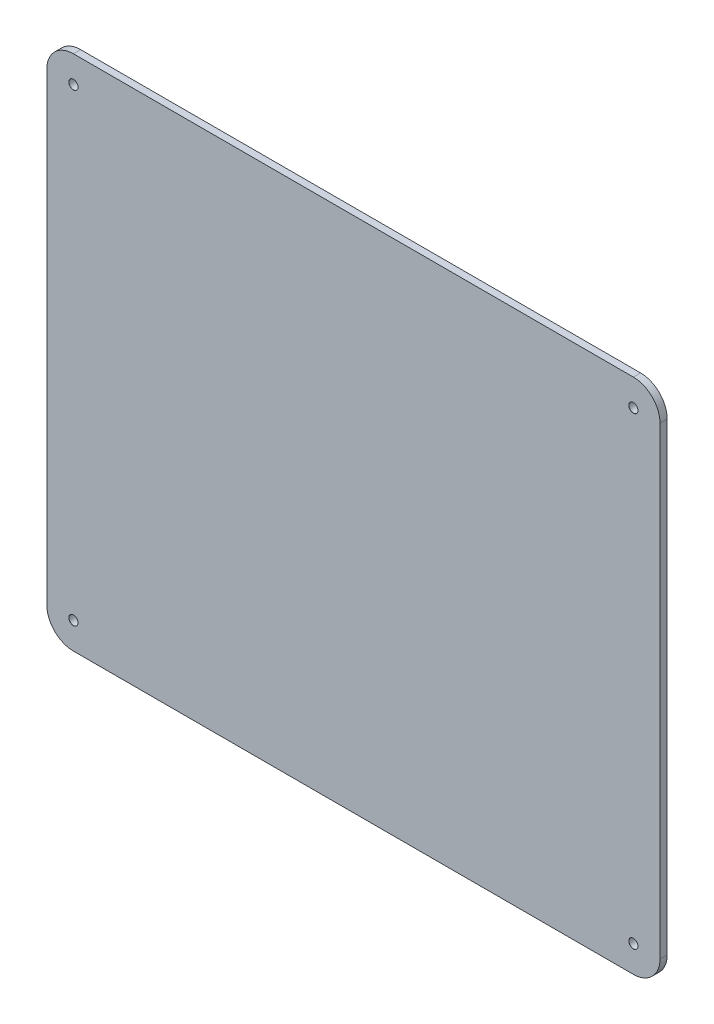
ISO-10303-21;
HEADER;
FILE_DESCRIPTION(('STEP AP214'),'2;1');
FILE_NAME('part.step','',(''),(''),'','','');
FILE_SCHEMA(('AUTOMOTIVE_DESIGN { 1 0 10303 214 1 1 1 1 }'));
ENDSEC;
DATA;
#1=APPLICATION_CONTEXT('core data for automotive mechanical design processes');
#2=APPLICATION_PROTOCOL_DEFINITION('international standard','automotive_design',2000,#1);
#3=PRODUCT_CONTEXT('',#1,'mechanical');
#4=PRODUCT('Part','Part','',(#3));
#5=PRODUCT_RELATED_PRODUCT_CATEGORY('part','',(#4));
#6=PRODUCT_DEFINITION_FORMATION('','',#4);
#7=PRODUCT_DEFINITION_CONTEXT('part definition',#1,'design');
#8=PRODUCT_DEFINITION('design','',#6,#7);
#9=PRODUCT_DEFINITION_SHAPE('','',#8);
#10=(LENGTH_UNIT() NAMED_UNIT(*) SI_UNIT(.MILLI.,.METRE.));
#11=(NAMED_UNIT(*) PLANE_ANGLE_UNIT() SI_UNIT($,.RADIAN.));
#12=(NAMED_UNIT(*) SI_UNIT($,.STERADIAN.) SOLID_ANGLE_UNIT());
#13=UNCERTAINTY_MEASURE_WITH_UNIT(LENGTH_MEASURE(1.E-05),#10,'distance_accuracy_value','');
#14=(GEOMETRIC_REPRESENTATION_CONTEXT(3) GLOBAL_UNCERTAINTY_ASSIGNED_CONTEXT((#13)) GLOBAL_UNIT_ASSIGNED_CONTEXT((#10,
#11,#12)) REPRESENTATION_CONTEXT('',''));
#15=CARTESIAN_POINT('',(0.,0.,0.));
#16=DIRECTION('',(0.,0.,1.));
#17=DIRECTION('',(1.,0.,0.));
#18=AXIS2_PLACEMENT_3D('',#15,#16,#17);
#19=CARTESIAN_POINT('',(-210.,-240.,0.));
#20=DIRECTION('',(0.,0.,-1.));
#21=DIRECTION('',(-1.,0.,0.));
#22=AXIS2_PLACEMENT_3D('',#19,#20,#21);
#23=PLANE('',#22);
#24=CARTESIAN_POINT('',(0.,-240.,0.));
#25=DIRECTION('',(0.,0.,1.));
#26=DIRECTION('',(1.,0.,0.));
#27=AXIS2_PLACEMENT_3D('',#24,#25,#26);
#28=CIRCLE('',#27,1.7);
#29=CARTESIAN_POINT('',(1.7,-240.,0.));
#30=VERTEX_POINT('',#29);
#31=EDGE_CURVE('E247',#30,#30,#28,.T.);
#32=ORIENTED_EDGE('',*,*,#31,.T.);
#33=EDGE_LOOP('',(#32));
#34=FACE_BOUND('',#33,.T.);
#35=CARTESIAN_POINT('',(-210.,-240.,0.));
#36=DIRECTION('',(0.,0.,1.));
#37=DIRECTION('',(1.,0.,0.));
#38=AXIS2_PLACEMENT_3D('',#35,#36,#37);
#39=CIRCLE('',#38,1.70000000000001);
#40=CARTESIAN_POINT('',(-208.3,-240.,0.));
#41=VERTEX_POINT('',#40);
#42=EDGE_CURVE('E235',#41,#41,#39,.T.);
#43=ORIENTED_EDGE('',*,*,#42,.T.);
#44=EDGE_LOOP('',(#43));
#45=FACE_BOUND('',#44,.T.);
#46=CARTESIAN_POINT('',(-210.,-65.988369189522,0.));
#47=DIRECTION('',(0.,0.,1.));
#48=DIRECTION('',(1.,0.,0.));
#49=AXIS2_PLACEMENT_3D('',#46,#47,#48);
#50=CIRCLE('',#49,1.70000000000001);
#51=CARTESIAN_POINT('',(-208.3,-65.988369189522,0.));
#52=VERTEX_POINT('',#51);
#53=EDGE_CURVE('E223',#52,#52,#50,.T.);
#54=ORIENTED_EDGE('',*,*,#53,.T.);
#55=EDGE_LOOP('',(#54));
#56=FACE_BOUND('',#55,.T.);
#57=CARTESIAN_POINT('',(-210.,-240.,0.));
#58=DIRECTION('',(0.,0.,1.));
#59=DIRECTION('',(-1.,0.,0.));
#60=AXIS2_PLACEMENT_3D('',#57,#58,#59);
#61=CIRCLE('',#60,10.);
#62=CARTESIAN_POINT('',(-220.,-240.,0.));
#63=VERTEX_POINT('',#62);
#64=CARTESIAN_POINT('',(-210.,-250.,0.));
#65=VERTEX_POINT('',#64);
#66=EDGE_CURVE('E145',#63,#65,#61,.T.);
#67=ORIENTED_EDGE('',*,*,#66,.F.);
#68=DIRECTION('',(0.,-1.,0.));
#69=VECTOR('',#68,1.);
#70=CARTESIAN_POINT('',(-220.,-240.,0.));
#71=LINE('',#70,#69);
#72=CARTESIAN_POINT('',(-220.,-65.9883691895221,0.));
#73=VERTEX_POINT('',#72);
#74=EDGE_CURVE('E96',#73,#63,#71,.T.);
#75=ORIENTED_EDGE('',*,*,#74,.F.);
#76=CARTESIAN_POINT('',(-210.,-65.988369189522,0.));
#77=DIRECTION('',(0.,0.,1.));
#78=DIRECTION('',(1.,0.,0.));
#79=AXIS2_PLACEMENT_3D('',#76,#77,#78);
#80=CIRCLE('',#79,10.);
#81=CARTESIAN_POINT('',(-210.,-55.988369189522,0.));
#82=VERTEX_POINT('',#81);
#83=EDGE_CURVE('E90',#82,#73,#80,.T.);
#84=ORIENTED_EDGE('',*,*,#83,.F.);
#85=DIRECTION('',(-1.,0.,0.));
#86=VECTOR('',#85,1.);
#87=CARTESIAN_POINT('',(0.,-55.988369189522,0.));
#88=LINE('',#87,#86);
#89=CARTESIAN_POINT('',(0.,-55.988369189522,0.));
#90=VERTEX_POINT('',#89);
#91=EDGE_CURVE('E132',#90,#82,#88,.T.);
#92=ORIENTED_EDGE('',*,*,#91,.F.);
#93=CARTESIAN_POINT('',(0.,-65.988369189522,0.));
#94=DIRECTION('',(0.,0.,1.));
#95=DIRECTION('',(1.,0.,0.));
#96=AXIS2_PLACEMENT_3D('',#93,#94,#95);
#97=CIRCLE('',#96,10.);
#98=CARTESIAN_POINT('',(10.,-65.9883691895221,0.));
#99=VERTEX_POINT('',#98);
#100=EDGE_CURVE('E159',#99,#90,#97,.T.);
#101=ORIENTED_EDGE('',*,*,#100,.F.);
#102=DIRECTION('',(0.,1.,0.));
#103=VECTOR('',#102,1.);
#104=CARTESIAN_POINT('',(10.,-240.,0.));
#105=LINE('',#104,#103);
#106=CARTESIAN_POINT('',(10.,-240.,0.));
#107=VERTEX_POINT('',#106);
#108=EDGE_CURVE('E156',#107,#99,#105,.T.);
#109=ORIENTED_EDGE('',*,*,#108,.F.);
#110=CARTESIAN_POINT('',(0.,-240.,0.));
#111=DIRECTION('',(0.,0.,1.));
#112=DIRECTION('',(1.,0.,0.));
#113=AXIS2_PLACEMENT_3D('',#110,#111,#112);
#114=CIRCLE('',#113,10.);
#115=CARTESIAN_POINT('',(0.,-250.,0.));
#116=VERTEX_POINT('',#115);
#117=EDGE_CURVE('E153',#116,#107,#114,.T.);
#118=ORIENTED_EDGE('',*,*,#117,.F.);
#119=DIRECTION('',(1.,0.,0.));
#120=VECTOR('',#119,1.);
#121=CARTESIAN_POINT('',(0.,-250.,0.));
#122=LINE('',#121,#120);
#123=EDGE_CURVE('E149',#65,#116,#122,.T.);
#124=ORIENTED_EDGE('',*,*,#123,.F.);
#125=EDGE_LOOP('',(#67,#75,#84,#92,#101,#109,#118,#124));
#126=FACE_BOUND('',#125,.T.);
#127=CARTESIAN_POINT('',(0.,-65.988369189522,0.));
#128=DIRECTION('',(0.,0.,1.));
#129=DIRECTION('',(1.,0.,0.));
#130=AXIS2_PLACEMENT_3D('',#127,#128,#129);
#131=CIRCLE('',#130,1.7);
#132=CARTESIAN_POINT('',(1.7,-65.988369189522,0.));
#133=VERTEX_POINT('',#132);
#134=EDGE_CURVE('E150',#133,#133,#131,.T.);
#135=ORIENTED_EDGE('',*,*,#134,.T.);
#136=EDGE_LOOP('',(#135));
#137=FACE_BOUND('',#136,.T.);
#138=ADVANCED_FACE('F43',(#34,#45,#56,#126,#137),#23,.T.);
#139=CARTESIAN_POINT('',(-210.,-240.,2.7));
#140=DIRECTION('',(0.,0.,-1.));
#141=DIRECTION('',(-1.,0.,0.));
#142=AXIS2_PLACEMENT_3D('',#139,#140,#141);
#143=CYLINDRICAL_SURFACE('',#142,10.);
#144=ORIENTED_EDGE('',*,*,#66,.T.);
#145=DIRECTION('',(0.,0.,-1.));
#146=VECTOR('',#145,1.);
#147=CARTESIAN_POINT('',(-210.,-250.,2.7));
#148=LINE('',#147,#146);
#149=CARTESIAN_POINT('',(-210.,-250.,2.7));
#150=VERTEX_POINT('',#149);
#151=EDGE_CURVE('E11',#150,#65,#148,.T.);
#152=ORIENTED_EDGE('',*,*,#151,.F.);
#153=CARTESIAN_POINT('',(-210.,-240.,2.7));
#154=DIRECTION('',(0.,0.,1.));
#155=DIRECTION('',(-1.,0.,0.));
#156=AXIS2_PLACEMENT_3D('',#153,#154,#155);
#157=CIRCLE('',#156,10.);
#158=CARTESIAN_POINT('',(-220.,-240.,2.7));
#159=VERTEX_POINT('',#158);
#160=EDGE_CURVE('E168',#159,#150,#157,.T.);
#161=ORIENTED_EDGE('',*,*,#160,.F.);
#162=DIRECTION('',(0.,0.,-1.));
#163=VECTOR('',#162,1.);
#164=CARTESIAN_POINT('',(-220.,-240.,2.7));
#165=LINE('',#164,#163);
#166=EDGE_CURVE('E141',#159,#63,#165,.T.);
#167=ORIENTED_EDGE('',*,*,#166,.T.);
#168=EDGE_LOOP('',(#144,#152,#161,#167));
#169=FACE_BOUND('',#168,.T.);
#170=ADVANCED_FACE('F45',(#169),#143,.T.);
#171=CARTESIAN_POINT('',(0.,-250.,2.7));
#172=DIRECTION('',(0.,1.,0.));
#173=DIRECTION('',(0.,0.,1.));
#174=AXIS2_PLACEMENT_3D('',#171,#172,#173);
#175=PLANE('',#174);
#176=ORIENTED_EDGE('',*,*,#123,.T.);
#177=DIRECTION('',(0.,0.,-1.));
#178=VECTOR('',#177,1.);
#179=CARTESIAN_POINT('',(0.,-250.,2.7));
#180=LINE('',#179,#178);
#181=CARTESIAN_POINT('',(0.,-250.,2.7));
#182=VERTEX_POINT('',#181);
#183=EDGE_CURVE('E53',#182,#116,#180,.T.);
#184=ORIENTED_EDGE('',*,*,#183,.F.);
#185=DIRECTION('',(1.,0.,0.));
#186=VECTOR('',#185,1.);
#187=CARTESIAN_POINT('',(0.,-250.,2.7));
#188=LINE('',#187,#186);
#189=EDGE_CURVE('E104',#150,#182,#188,.T.);
#190=ORIENTED_EDGE('',*,*,#189,.F.);
#191=ORIENTED_EDGE('',*,*,#151,.T.);
#192=EDGE_LOOP('',(#176,#184,#190,#191));
#193=FACE_BOUND('',#192,.T.);
#194=ADVANCED_FACE('F294',(#193),#175,.F.);
#195=CARTESIAN_POINT('',(0.,-240.,2.7));
#196=DIRECTION('',(0.,0.,-1.));
#197=DIRECTION('',(-1.,0.,0.));
#198=AXIS2_PLACEMENT_3D('',#195,#196,#197);
#199=CYLINDRICAL_SURFACE('',#198,10.);
#200=ORIENTED_EDGE('',*,*,#117,.T.);
#201=DIRECTION('',(0.,0.,-1.));
#202=VECTOR('',#201,1.);
#203=CARTESIAN_POINT('',(10.,-240.,2.7));
#204=LINE('',#203,#202);
#205=CARTESIAN_POINT('',(10.,-240.,2.7));
#206=VERTEX_POINT('',#205);
#207=EDGE_CURVE('E179',#206,#107,#204,.T.);
#208=ORIENTED_EDGE('',*,*,#207,.F.);
#209=CARTESIAN_POINT('',(0.,-240.,2.7));
#210=DIRECTION('',(0.,0.,1.));
#211=DIRECTION('',(1.,0.,0.));
#212=AXIS2_PLACEMENT_3D('',#209,#210,#211);
#213=CIRCLE('',#212,10.);
#214=EDGE_CURVE('E189',#182,#206,#213,.T.);
#215=ORIENTED_EDGE('',*,*,#214,.F.);
#216=ORIENTED_EDGE('',*,*,#183,.T.);
#217=EDGE_LOOP('',(#200,#208,#215,#216));
#218=FACE_BOUND('',#217,.T.);
#219=ADVANCED_FACE('F187',(#218),#199,.T.);
#220=CARTESIAN_POINT('',(10.,-240.,2.7));
#221=DIRECTION('',(-1.,0.,0.));
#222=DIRECTION('',(0.,0.,1.));
#223=AXIS2_PLACEMENT_3D('',#220,#221,#222);
#224=PLANE('',#223);
#225=ORIENTED_EDGE('',*,*,#108,.T.);
#226=DIRECTION('',(0.,0.,-1.));
#227=VECTOR('',#226,1.);
#228=CARTESIAN_POINT('',(10.,-65.9883691895221,2.7));
#229=LINE('',#228,#227);
#230=CARTESIAN_POINT('',(10.,-65.9883691895221,2.7));
#231=VERTEX_POINT('',#230);
#232=EDGE_CURVE('E175',#231,#99,#229,.T.);
#233=ORIENTED_EDGE('',*,*,#232,.F.);
#234=DIRECTION('',(0.,1.,0.));
#235=VECTOR('',#234,1.);
#236=CARTESIAN_POINT('',(10.,-240.,2.7));
#237=LINE('',#236,#235);
#238=EDGE_CURVE('E202',#206,#231,#237,.T.);
#239=ORIENTED_EDGE('',*,*,#238,.F.);
#240=ORIENTED_EDGE('',*,*,#207,.T.);
#241=EDGE_LOOP('',(#225,#233,#239,#240));
#242=FACE_BOUND('',#241,.T.);
#243=ADVANCED_FACE('F197',(#242),#224,.F.);
#244=CARTESIAN_POINT('',(0.,-65.988369189522,2.7));
#245=DIRECTION('',(0.,0.,-1.));
#246=DIRECTION('',(-1.,0.,0.));
#247=AXIS2_PLACEMENT_3D('',#244,#245,#246);
#248=CYLINDRICAL_SURFACE('',#247,10.);
#249=ORIENTED_EDGE('',*,*,#100,.T.);
#250=DIRECTION('',(0.,0.,-1.));
#251=VECTOR('',#250,1.);
#252=CARTESIAN_POINT('',(0.,-55.988369189522,2.7));
#253=LINE('',#252,#251);
#254=CARTESIAN_POINT('',(0.,-55.988369189522,2.7));
#255=VERTEX_POINT('',#254);
#256=EDGE_CURVE('E134',#255,#90,#253,.T.);
#257=ORIENTED_EDGE('',*,*,#256,.F.);
#258=CARTESIAN_POINT('',(0.,-65.988369189522,2.7));
#259=DIRECTION('',(0.,0.,1.));
#260=DIRECTION('',(1.,0.,0.));
#261=AXIS2_PLACEMENT_3D('',#258,#259,#260);
#262=CIRCLE('',#261,10.);
#263=EDGE_CURVE('E123',#231,#255,#262,.T.);
#264=ORIENTED_EDGE('',*,*,#263,.F.);
#265=ORIENTED_EDGE('',*,*,#232,.T.);
#266=EDGE_LOOP('',(#249,#257,#264,#265));
#267=FACE_BOUND('',#266,.T.);
#268=ADVANCED_FACE('F200',(#267),#248,.T.);
#269=CARTESIAN_POINT('',(0.,-55.988369189522,2.7));
#270=DIRECTION('',(0.,-1.,0.));
#271=DIRECTION('',(1.,0.,0.));
#272=AXIS2_PLACEMENT_3D('',#269,#270,#271);
#273=PLANE('',#272);
#274=ORIENTED_EDGE('',*,*,#91,.T.);
#275=DIRECTION('',(0.,0.,-1.));
#276=VECTOR('',#275,1.);
#277=CARTESIAN_POINT('',(-210.,-55.988369189522,2.7));
#278=LINE('',#277,#276);
#279=CARTESIAN_POINT('',(-210.,-55.988369189522,2.7));
#280=VERTEX_POINT('',#279);
#281=EDGE_CURVE('E129',#280,#82,#278,.T.);
#282=ORIENTED_EDGE('',*,*,#281,.F.);
#283=DIRECTION('',(-1.,0.,0.));
#284=VECTOR('',#283,1.);
#285=CARTESIAN_POINT('',(0.,-55.988369189522,2.7));
#286=LINE('',#285,#284);
#287=EDGE_CURVE('E117',#255,#280,#286,.T.);
#288=ORIENTED_EDGE('',*,*,#287,.F.);
#289=ORIENTED_EDGE('',*,*,#256,.T.);
#290=EDGE_LOOP('',(#274,#282,#288,#289));
#291=FACE_BOUND('',#290,.T.);
#292=ADVANCED_FACE('F130',(#291),#273,.F.);
#293=CARTESIAN_POINT('',(-210.,-65.988369189522,2.7));
#294=DIRECTION('',(0.,0.,-1.));
#295=DIRECTION('',(-1.,0.,0.));
#296=AXIS2_PLACEMENT_3D('',#293,#294,#295);
#297=CYLINDRICAL_SURFACE('',#296,10.);
#298=ORIENTED_EDGE('',*,*,#83,.T.);
#299=DIRECTION('',(0.,0.,-1.));
#300=VECTOR('',#299,1.);
#301=CARTESIAN_POINT('',(-220.,-65.9883691895221,2.7));
#302=LINE('',#301,#300);
#303=CARTESIAN_POINT('',(-220.,-65.9883691895221,2.7));
#304=VERTEX_POINT('',#303);
#305=EDGE_CURVE('E135',#304,#73,#302,.T.);
#306=ORIENTED_EDGE('',*,*,#305,.F.);
#307=CARTESIAN_POINT('',(-210.,-65.988369189522,2.7));
#308=DIRECTION('',(0.,0.,1.));
#309=DIRECTION('',(1.,0.,0.));
#310=AXIS2_PLACEMENT_3D('',#307,#308,#309);
#311=CIRCLE('',#310,10.);
#312=EDGE_CURVE('E121',#280,#304,#311,.T.);
#313=ORIENTED_EDGE('',*,*,#312,.F.);
#314=ORIENTED_EDGE('',*,*,#281,.T.);
#315=EDGE_LOOP('',(#298,#306,#313,#314));
#316=FACE_BOUND('',#315,.T.);
#317=ADVANCED_FACE('F137',(#316),#297,.T.);
#318=CARTESIAN_POINT('',(-220.,-240.,2.7));
#319=DIRECTION('',(1.,0.,0.));
#320=DIRECTION('',(0.,0.,-1.));
#321=AXIS2_PLACEMENT_3D('',#318,#319,#320);
#322=PLANE('',#321);
#323=ORIENTED_EDGE('',*,*,#74,.T.);
#324=ORIENTED_EDGE('',*,*,#166,.F.);
#325=DIRECTION('',(0.,-1.,0.));
#326=VECTOR('',#325,1.);
#327=CARTESIAN_POINT('',(-220.,-240.,2.7));
#328=LINE('',#327,#326);
#329=EDGE_CURVE('E61',#304,#159,#328,.T.);
#330=ORIENTED_EDGE('',*,*,#329,.F.);
#331=ORIENTED_EDGE('',*,*,#305,.T.);
#332=EDGE_LOOP('',(#323,#324,#330,#331));
#333=FACE_BOUND('',#332,.T.);
#334=ADVANCED_FACE('F265',(#333),#322,.F.);
#335=CARTESIAN_POINT('',(-210.,-240.,2.7));
#336=DIRECTION('',(0.,0.,-1.));
#337=DIRECTION('',(-1.,0.,0.));
#338=AXIS2_PLACEMENT_3D('',#335,#336,#337);
#339=PLANE('',#338);
#340=CARTESIAN_POINT('',(0.,-240.,2.7));
#341=DIRECTION('',(0.,0.,1.));
#342=DIRECTION('',(1.,0.,0.));
#343=AXIS2_PLACEMENT_3D('',#340,#341,#342);
#344=CIRCLE('',#343,1.725);
#345=CARTESIAN_POINT('',(1.725,-240.,2.7));
#346=VERTEX_POINT('',#345);
#347=EDGE_CURVE('E255',#346,#346,#344,.T.);
#348=ORIENTED_EDGE('',*,*,#347,.F.);
#349=EDGE_LOOP('',(#348));
#350=FACE_BOUND('',#349,.T.);
#351=CARTESIAN_POINT('',(-210.,-240.,2.7));
#352=DIRECTION('',(0.,0.,1.));
#353=DIRECTION('',(1.,0.,0.));
#354=AXIS2_PLACEMENT_3D('',#351,#352,#353);
#355=CIRCLE('',#354,1.725);
#356=CARTESIAN_POINT('',(-208.275,-240.,2.7));
#357=VERTEX_POINT('',#356);
#358=EDGE_CURVE('E243',#357,#357,#355,.T.);
#359=ORIENTED_EDGE('',*,*,#358,.F.);
#360=EDGE_LOOP('',(#359));
#361=FACE_BOUND('',#360,.T.);
#362=CARTESIAN_POINT('',(-210.,-65.988369189522,2.7));
#363=DIRECTION('',(0.,0.,1.));
#364=DIRECTION('',(1.,0.,0.));
#365=AXIS2_PLACEMENT_3D('',#362,#363,#364);
#366=CIRCLE('',#365,1.725);
#367=CARTESIAN_POINT('',(-208.275,-65.988369189522,2.7));
#368=VERTEX_POINT('',#367);
#369=EDGE_CURVE('E231',#368,#368,#366,.T.);
#370=ORIENTED_EDGE('',*,*,#369,.F.);
#371=EDGE_LOOP('',(#370));
#372=FACE_BOUND('',#371,.T.);
#373=CARTESIAN_POINT('',(0.,-65.988369189522,2.7));
#374=DIRECTION('',(0.,0.,1.));
#375=DIRECTION('',(1.,0.,0.));
#376=AXIS2_PLACEMENT_3D('',#373,#374,#375);
#377=CIRCLE('',#376,1.725);
#378=CARTESIAN_POINT('',(1.725,-65.988369189522,2.7));
#379=VERTEX_POINT('',#378);
#380=EDGE_CURVE('E219',#379,#379,#377,.T.);
#381=ORIENTED_EDGE('',*,*,#380,.F.);
#382=EDGE_LOOP('',(#381));
#383=FACE_BOUND('',#382,.T.);
#384=ORIENTED_EDGE('',*,*,#160,.T.);
#385=ORIENTED_EDGE('',*,*,#189,.T.);
#386=ORIENTED_EDGE('',*,*,#214,.T.);
#387=ORIENTED_EDGE('',*,*,#238,.T.);
#388=ORIENTED_EDGE('',*,*,#263,.T.);
#389=ORIENTED_EDGE('',*,*,#287,.T.);
#390=ORIENTED_EDGE('',*,*,#312,.T.);
#391=ORIENTED_EDGE('',*,*,#329,.T.);
#392=EDGE_LOOP('',(#384,#385,#386,#387,#388,#389,#390,#391));
#393=FACE_BOUND('',#392,.T.);
#394=ADVANCED_FACE('F119',(#350,#361,#372,#383,#393),#339,.F.);
#395=CARTESIAN_POINT('',(0.,-65.988369189522,2.7));
#396=DIRECTION('',(0.,0.,1.));
#397=DIRECTION('',(1.,0.,0.));
#398=AXIS2_PLACEMENT_3D('',#395,#396,#397);
#399=CYLINDRICAL_SURFACE('',#398,1.7);
#400=ORIENTED_EDGE('',*,*,#134,.F.);
#401=EDGE_LOOP('',(#400));
#402=FACE_BOUND('',#401,.T.);
#403=CARTESIAN_POINT('',(0.,-65.988369189522,2.675));
#404=DIRECTION('',(0.,0.,1.));
#405=DIRECTION('',(1.,0.,0.));
#406=AXIS2_PLACEMENT_3D('',#403,#404,#405);
#407=CIRCLE('',#406,1.7);
#408=CARTESIAN_POINT('',(1.7,-65.988369189522,2.675));
#409=VERTEX_POINT('',#408);
#410=EDGE_CURVE('E215',#409,#409,#407,.T.);
#411=ORIENTED_EDGE('',*,*,#410,.T.);
#412=EDGE_LOOP('',(#411));
#413=FACE_BOUND('',#412,.T.);
#414=ADVANCED_FACE('F264',(#402,#413),#399,.F.);
#415=CARTESIAN_POINT('',(0.,-65.988369189522,2.7));
#416=DIRECTION('',(0.,0.,1.));
#417=DIRECTION('',(1.,0.,0.));
#418=AXIS2_PLACEMENT_3D('',#415,#416,#417);
#419=CONICAL_SURFACE('',#418,1.725,0.785398163397422);
#420=ORIENTED_EDGE('',*,*,#410,.F.);
#421=EDGE_LOOP('',(#420));
#422=FACE_BOUND('',#421,.T.);
#423=ORIENTED_EDGE('',*,*,#380,.T.);
#424=EDGE_LOOP('',(#423));
#425=FACE_BOUND('',#424,.T.);
#426=ADVANCED_FACE('F273',(#422,#425),#419,.F.);
#427=CARTESIAN_POINT('',(-210.,-65.988369189522,2.7));
#428=DIRECTION('',(0.,0.,1.));
#429=DIRECTION('',(1.,0.,0.));
#430=AXIS2_PLACEMENT_3D('',#427,#428,#429);
#431=CYLINDRICAL_SURFACE('',#430,1.70000000000001);
#432=ORIENTED_EDGE('',*,*,#53,.F.);
#433=EDGE_LOOP('',(#432));
#434=FACE_BOUND('',#433,.T.);
#435=CARTESIAN_POINT('',(-210.,-65.988369189522,2.675));
#436=DIRECTION('',(0.,0.,1.));
#437=DIRECTION('',(1.,0.,0.));
#438=AXIS2_PLACEMENT_3D('',#435,#436,#437);
#439=CIRCLE('',#438,1.70000000000001);
#440=CARTESIAN_POINT('',(-208.3,-65.988369189522,2.675));
#441=VERTEX_POINT('',#440);
#442=EDGE_CURVE('E227',#441,#441,#439,.T.);
#443=ORIENTED_EDGE('',*,*,#442,.T.);
#444=EDGE_LOOP('',(#443));
#445=FACE_BOUND('',#444,.T.);
#446=ADVANCED_FACE('F275',(#434,#445),#431,.F.);
#447=CARTESIAN_POINT('',(-210.,-65.988369189522,2.7));
#448=DIRECTION('',(0.,0.,1.));
#449=DIRECTION('',(1.,0.,0.));
#450=AXIS2_PLACEMENT_3D('',#447,#448,#449);
#451=CONICAL_SURFACE('',#450,1.725,0.785398163397344);
#452=ORIENTED_EDGE('',*,*,#442,.F.);
#453=EDGE_LOOP('',(#452));
#454=FACE_BOUND('',#453,.T.);
#455=ORIENTED_EDGE('',*,*,#369,.T.);
#456=EDGE_LOOP('',(#455));
#457=FACE_BOUND('',#456,.T.);
#458=ADVANCED_FACE('F282',(#454,#457),#451,.F.);
#459=CARTESIAN_POINT('',(-210.,-240.,2.7));
#460=DIRECTION('',(0.,0.,1.));
#461=DIRECTION('',(1.,0.,0.));
#462=AXIS2_PLACEMENT_3D('',#459,#460,#461);
#463=CYLINDRICAL_SURFACE('',#462,1.70000000000001);
#464=ORIENTED_EDGE('',*,*,#42,.F.);
#465=EDGE_LOOP('',(#464));
#466=FACE_BOUND('',#465,.T.);
#467=CARTESIAN_POINT('',(-210.,-240.,2.675));
#468=DIRECTION('',(0.,0.,1.));
#469=DIRECTION('',(1.,0.,0.));
#470=AXIS2_PLACEMENT_3D('',#467,#468,#469);
#471=CIRCLE('',#470,1.70000000000001);
#472=CARTESIAN_POINT('',(-208.3,-240.,2.675));
#473=VERTEX_POINT('',#472);
#474=EDGE_CURVE('E239',#473,#473,#471,.T.);
#475=ORIENTED_EDGE('',*,*,#474,.T.);
#476=EDGE_LOOP('',(#475));
#477=FACE_BOUND('',#476,.T.);
#478=ADVANCED_FACE('F371',(#466,#477),#463,.F.);
#479=CARTESIAN_POINT('',(-210.,-240.,2.7));
#480=DIRECTION('',(0.,0.,1.));
#481=DIRECTION('',(1.,0.,0.));
#482=AXIS2_PLACEMENT_3D('',#479,#480,#481);
#483=CONICAL_SURFACE('',#482,1.725,0.785398163397344);
#484=ORIENTED_EDGE('',*,*,#474,.F.);
#485=EDGE_LOOP('',(#484));
#486=FACE_BOUND('',#485,.T.);
#487=ORIENTED_EDGE('',*,*,#358,.T.);
#488=EDGE_LOOP('',(#487));
#489=FACE_BOUND('',#488,.T.);
#490=ADVANCED_FACE('F382',(#486,#489),#483,.F.);
#491=CARTESIAN_POINT('',(0.,-240.,2.7));
#492=DIRECTION('',(0.,0.,1.));
#493=DIRECTION('',(1.,0.,0.));
#494=AXIS2_PLACEMENT_3D('',#491,#492,#493);
#495=CYLINDRICAL_SURFACE('',#494,1.7);
#496=ORIENTED_EDGE('',*,*,#31,.F.);
#497=EDGE_LOOP('',(#496));
#498=FACE_BOUND('',#497,.T.);
#499=CARTESIAN_POINT('',(0.,-240.,2.675));
#500=DIRECTION('',(0.,0.,1.));
#501=DIRECTION('',(1.,0.,0.));
#502=AXIS2_PLACEMENT_3D('',#499,#500,#501);
#503=CIRCLE('',#502,1.7);
#504=CARTESIAN_POINT('',(1.7,-240.,2.675));
#505=VERTEX_POINT('',#504);
#506=EDGE_CURVE('E251',#505,#505,#503,.T.);
#507=ORIENTED_EDGE('',*,*,#506,.T.);
#508=EDGE_LOOP('',(#507));
#509=FACE_BOUND('',#508,.T.);
#510=ADVANCED_FACE('F393',(#498,#509),#495,.F.);
#511=CARTESIAN_POINT('',(0.,-240.,2.7));
#512=DIRECTION('',(0.,0.,1.));
#513=DIRECTION('',(1.,0.,0.));
#514=AXIS2_PLACEMENT_3D('',#511,#512,#513);
#515=CONICAL_SURFACE('',#514,1.725,0.785398163397422);
#516=ORIENTED_EDGE('',*,*,#506,.F.);
#517=EDGE_LOOP('',(#516));
#518=FACE_BOUND('',#517,.T.);
#519=ORIENTED_EDGE('',*,*,#347,.T.);
#520=EDGE_LOOP('',(#519));
#521=FACE_BOUND('',#520,.T.);
#522=ADVANCED_FACE('F260',(#518,#521),#515,.F.);
#523=CLOSED_SHELL('',(#138,#170,#194,#219,#243,#268,#292,#317,#334,#394,#414,#426,#446,#458,
#478,#490,#510,#522));
#524=MANIFOLD_SOLID_BREP('B2',#523);
#525=ADVANCED_BREP_SHAPE_REPRESENTATION('',(#18,#524),#14);
#526=SHAPE_DEFINITION_REPRESENTATION(#9,#525);
ENDSEC;
END-ISO-10303-21;
